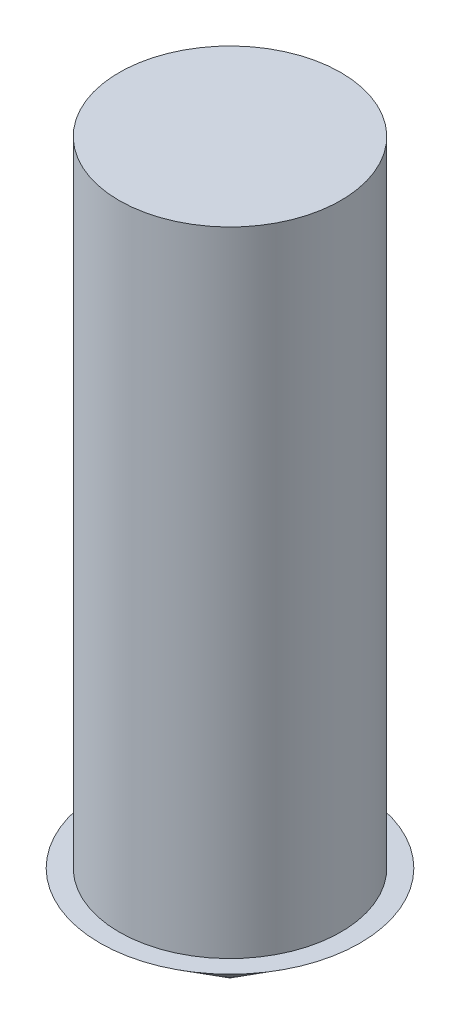
ISO-10303-21;
HEADER;
FILE_DESCRIPTION(('STEP AP214'),'2;1');
FILE_NAME('part.step','',(''),(''),'','','');
FILE_SCHEMA(('AUTOMOTIVE_DESIGN { 1 0 10303 214 1 1 1 1 }'));
ENDSEC;
DATA;
#1=APPLICATION_CONTEXT('core data for automotive mechanical design processes');
#2=APPLICATION_PROTOCOL_DEFINITION('international standard','automotive_design',2000,#1);
#3=PRODUCT_CONTEXT('',#1,'mechanical');
#4=PRODUCT('Part','Part','',(#3));
#5=PRODUCT_RELATED_PRODUCT_CATEGORY('part','',(#4));
#6=PRODUCT_DEFINITION_FORMATION('','',#4);
#7=PRODUCT_DEFINITION_CONTEXT('part definition',#1,'design');
#8=PRODUCT_DEFINITION('design','',#6,#7);
#9=PRODUCT_DEFINITION_SHAPE('','',#8);
#10=(LENGTH_UNIT() NAMED_UNIT(*) SI_UNIT(.MILLI.,.METRE.));
#11=(NAMED_UNIT(*) PLANE_ANGLE_UNIT() SI_UNIT($,.RADIAN.));
#12=(NAMED_UNIT(*) SI_UNIT($,.STERADIAN.) SOLID_ANGLE_UNIT());
#13=UNCERTAINTY_MEASURE_WITH_UNIT(LENGTH_MEASURE(1.E-05),#10,'distance_accuracy_value','');
#14=(GEOMETRIC_REPRESENTATION_CONTEXT(3) GLOBAL_UNCERTAINTY_ASSIGNED_CONTEXT((#13)) GLOBAL_UNIT_ASSIGNED_CONTEXT((#10,
#11,#12)) REPRESENTATION_CONTEXT('',''));
#15=CARTESIAN_POINT('',(0.,0.,0.));
#16=DIRECTION('',(0.,0.,1.));
#17=DIRECTION('',(1.,0.,0.));
#18=AXIS2_PLACEMENT_3D('',#15,#16,#17);
#19=CARTESIAN_POINT('',(0.,125.,0.));
#20=DIRECTION('',(0.,1.,0.));
#21=DIRECTION('',(0.,0.,1.));
#22=AXIS2_PLACEMENT_3D('',#19,#20,#21);
#23=PLANE('',#22);
#24=CARTESIAN_POINT('',(0.,125.,0.));
#25=DIRECTION('',(0.,-1.,0.));
#26=DIRECTION('',(0.,0.,-1.));
#27=AXIS2_PLACEMENT_3D('',#24,#25,#26);
#28=CIRCLE('',#27,17.5);
#29=CARTESIAN_POINT('',(0.,125.,-17.5));
#30=VERTEX_POINT('',#29);
#31=EDGE_CURVE('E11',#30,#30,#28,.T.);
#32=ORIENTED_EDGE('',*,*,#31,.F.);
#33=EDGE_LOOP('',(#32));
#34=FACE_BOUND('',#33,.T.);
#35=ADVANCED_FACE('F39',(#34),#23,.T.);
#36=CARTESIAN_POINT('',(0.,25.,0.));
#37=DIRECTION('',(0.,-1.,0.));
#38=DIRECTION('',(0.,0.,-1.));
#39=AXIS2_PLACEMENT_3D('',#36,#37,#38);
#40=CYLINDRICAL_SURFACE('',#39,17.5);
#41=ORIENTED_EDGE('',*,*,#31,.T.);
#42=EDGE_LOOP('',(#41));
#43=FACE_BOUND('',#42,.T.);
#44=CARTESIAN_POINT('',(0.,25.,0.));
#45=DIRECTION('',(0.,-1.,0.));
#46=DIRECTION('',(0.,0.,-1.));
#47=AXIS2_PLACEMENT_3D('',#44,#45,#46);
#48=CIRCLE('',#47,17.5);
#49=CARTESIAN_POINT('',(0.,25.,-17.5));
#50=VERTEX_POINT('',#49);
#51=EDGE_CURVE('E46',#50,#50,#48,.T.);
#52=ORIENTED_EDGE('',*,*,#51,.F.);
#53=EDGE_LOOP('',(#52));
#54=FACE_BOUND('',#53,.T.);
#55=ADVANCED_FACE('F57',(#43,#54),#40,.T.);
#56=CARTESIAN_POINT('',(17.5,25.,0.));
#57=DIRECTION('',(0.,1.,0.));
#58=DIRECTION('',(0.,0.,1.));
#59=AXIS2_PLACEMENT_3D('',#56,#57,#58);
#60=PLANE('',#59);
#61=ORIENTED_EDGE('',*,*,#51,.T.);
#62=EDGE_LOOP('',(#61));
#63=FACE_BOUND('',#62,.T.);
#64=CARTESIAN_POINT('',(0.,25.,0.));
#65=DIRECTION('',(0.,-1.,0.));
#66=DIRECTION('',(0.,0.,-1.));
#67=AXIS2_PLACEMENT_3D('',#64,#65,#66);
#68=CIRCLE('',#67,20.52);
#69=CARTESIAN_POINT('',(0.,25.,-20.52));
#70=VERTEX_POINT('',#69);
#71=EDGE_CURVE('E72',#70,#70,#68,.T.);
#72=ORIENTED_EDGE('',*,*,#71,.F.);
#73=EDGE_LOOP('',(#72));
#74=FACE_BOUND('',#73,.T.);
#75=ADVANCED_FACE('F51',(#63,#74),#60,.T.);
#76=CARTESIAN_POINT('',(0.,9.97362512074673,0.));
#77=DIRECTION('',(0.,1.,0.));
#78=DIRECTION('',(0.,0.,1.));
#79=AXIS2_PLACEMENT_3D('',#76,#77,#78);
#80=CONICAL_SURFACE('',#79,0.,0.938733147113207);
#81=ORIENTED_EDGE('',*,*,#71,.T.);
#82=EDGE_LOOP('',(#81));
#83=FACE_BOUND('',#82,.T.);
#84=CARTESIAN_POINT('',(0.,9.97362512074673,0.));
#85=VERTEX_POINT('',#84);
#86=VERTEX_LOOP('',#85);
#87=FACE_BOUND('',#86,.T.);
#88=ADVANCED_FACE('F49',(#83,#87),#80,.T.);
#89=CLOSED_SHELL('',(#35,#55,#75,#88));
#90=MANIFOLD_SOLID_BREP('B2',#89);
#91=ADVANCED_BREP_SHAPE_REPRESENTATION('',(#18,#90),#14);
#92=SHAPE_DEFINITION_REPRESENTATION(#9,#91);
ENDSEC;
END-ISO-10303-21;
